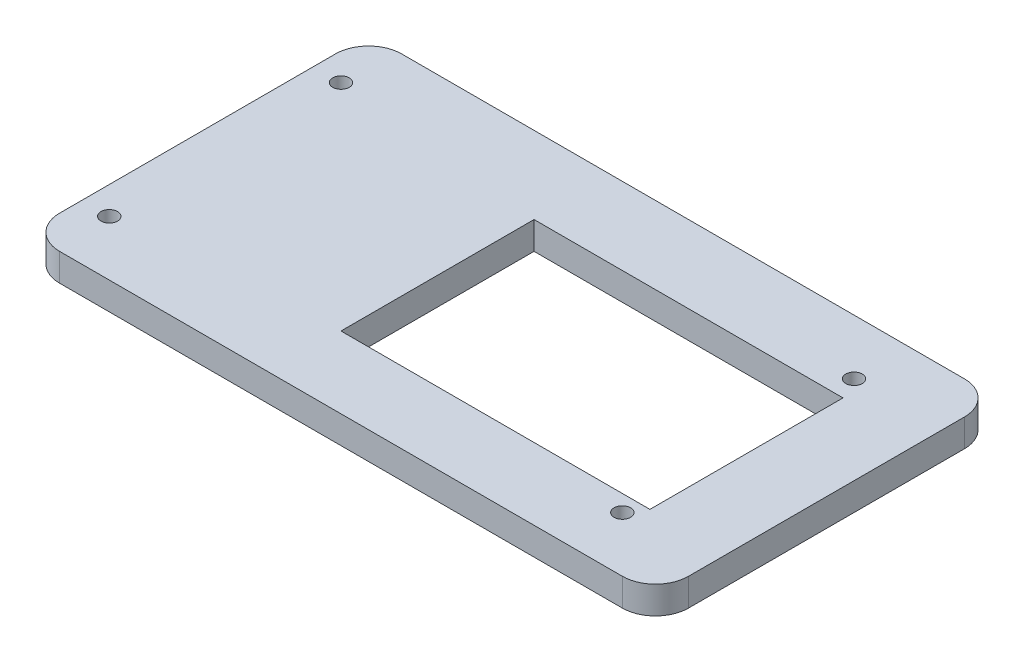
ISO-10303-21;
HEADER;
FILE_DESCRIPTION(('STEP AP214'),'2;1');
FILE_NAME('part.step','',(''),(''),'','','');
FILE_SCHEMA(('AUTOMOTIVE_DESIGN { 1 0 10303 214 1 1 1 1 }'));
ENDSEC;
DATA;
#1=APPLICATION_CONTEXT('core data for automotive mechanical design processes');
#2=APPLICATION_PROTOCOL_DEFINITION('international standard','automotive_design',2000,#1);
#3=PRODUCT_CONTEXT('',#1,'mechanical');
#4=PRODUCT('Part','Part','',(#3));
#5=PRODUCT_RELATED_PRODUCT_CATEGORY('part','',(#4));
#6=PRODUCT_DEFINITION_FORMATION('','',#4);
#7=PRODUCT_DEFINITION_CONTEXT('part definition',#1,'design');
#8=PRODUCT_DEFINITION('design','',#6,#7);
#9=PRODUCT_DEFINITION_SHAPE('','',#8);
#10=(LENGTH_UNIT() NAMED_UNIT(*) SI_UNIT(.MILLI.,.METRE.));
#11=(NAMED_UNIT(*) PLANE_ANGLE_UNIT() SI_UNIT($,.RADIAN.));
#12=(NAMED_UNIT(*) SI_UNIT($,.STERADIAN.) SOLID_ANGLE_UNIT());
#13=UNCERTAINTY_MEASURE_WITH_UNIT(LENGTH_MEASURE(1.E-05),#10,'distance_accuracy_value','');
#14=(GEOMETRIC_REPRESENTATION_CONTEXT(3) GLOBAL_UNCERTAINTY_ASSIGNED_CONTEXT((#13)) GLOBAL_UNIT_ASSIGNED_CONTEXT((#10,
#11,#12)) REPRESENTATION_CONTEXT('',''));
#15=CARTESIAN_POINT('',(0.,0.,0.));
#16=DIRECTION('',(0.,0.,1.));
#17=DIRECTION('',(1.,0.,0.));
#18=AXIS2_PLACEMENT_3D('',#15,#16,#17);
#19=CARTESIAN_POINT('',(0.,5.,0.));
#20=DIRECTION('',(0.,-1.,0.));
#21=DIRECTION('',(0.,0.,-1.));
#22=AXIS2_PLACEMENT_3D('',#19,#20,#21);
#23=PLANE('',#22);
#24=CARTESIAN_POINT('',(15.5,5.,-21.));
#25=DIRECTION('',(0.,-1.,0.));
#26=DIRECTION('',(0.,0.,-1.));
#27=AXIS2_PLACEMENT_3D('',#24,#25,#26);
#28=CIRCLE('',#27,1.5);
#29=CARTESIAN_POINT('',(15.5,5.,-22.5));
#30=VERTEX_POINT('',#29);
#31=EDGE_CURVE('E421',#30,#30,#28,.T.);
#32=ORIENTED_EDGE('',*,*,#31,.T.);
#33=EDGE_LOOP('',(#32));
#34=FACE_BOUND('',#33,.T.);
#35=CARTESIAN_POINT('',(15.5,5.,21.));
#36=DIRECTION('',(0.,-1.,0.));
#37=DIRECTION('',(0.,0.,-1.));
#38=AXIS2_PLACEMENT_3D('',#35,#36,#37);
#39=CIRCLE('',#38,1.5);
#40=CARTESIAN_POINT('',(15.5,5.,19.5));
#41=VERTEX_POINT('',#40);
#42=EDGE_CURVE('E425',#41,#41,#39,.T.);
#43=ORIENTED_EDGE('',*,*,#42,.T.);
#44=EDGE_LOOP('',(#43));
#45=FACE_BOUND('',#44,.T.);
#46=CARTESIAN_POINT('',(-77.5,5.,-21.));
#47=DIRECTION('',(0.,-1.,0.));
#48=DIRECTION('',(0.,0.,-1.));
#49=AXIS2_PLACEMENT_3D('',#46,#47,#48);
#50=CIRCLE('',#49,1.5);
#51=CARTESIAN_POINT('',(-77.5,5.,-22.5));
#52=VERTEX_POINT('',#51);
#53=EDGE_CURVE('E434',#52,#52,#50,.T.);
#54=ORIENTED_EDGE('',*,*,#53,.T.);
#55=EDGE_LOOP('',(#54));
#56=FACE_BOUND('',#55,.T.);
#57=CARTESIAN_POINT('',(-77.5,5.,21.));
#58=DIRECTION('',(0.,-1.,0.));
#59=DIRECTION('',(0.,0.,-1.));
#60=AXIS2_PLACEMENT_3D('',#57,#58,#59);
#61=CIRCLE('',#60,1.5);
#62=CARTESIAN_POINT('',(-77.5,5.,19.5));
#63=VERTEX_POINT('',#62);
#64=EDGE_CURVE('E158',#63,#63,#61,.T.);
#65=ORIENTED_EDGE('',*,*,#64,.T.);
#66=EDGE_LOOP('',(#65));
#67=FACE_BOUND('',#66,.T.);
#68=DIRECTION('',(1.,0.,0.));
#69=VECTOR('',#68,1.);
#70=CARTESIAN_POINT('',(31.5,5.,31.));
#71=LINE('',#70,#69);
#72=CARTESIAN_POINT('',(-76.5,5.,31.));
#73=VERTEX_POINT('',#72);
#74=CARTESIAN_POINT('',(25.5,5.,31.));
#75=VERTEX_POINT('',#74);
#76=EDGE_CURVE('E169',#73,#75,#71,.T.);
#77=ORIENTED_EDGE('',*,*,#76,.T.);
#78=CARTESIAN_POINT('',(25.5,5.,25.));
#79=DIRECTION('',(0.,-1.,0.));
#80=DIRECTION('',(0.,0.,-1.));
#81=AXIS2_PLACEMENT_3D('',#78,#79,#80);
#82=CIRCLE('',#81,6.);
#83=CARTESIAN_POINT('',(31.5,5.,25.));
#84=VERTEX_POINT('',#83);
#85=EDGE_CURVE('E212',#75,#84,#82,.F.);
#86=ORIENTED_EDGE('',*,*,#85,.T.);
#87=DIRECTION('',(0.,0.,-1.));
#88=VECTOR('',#87,1.);
#89=CARTESIAN_POINT('',(31.5,5.,31.));
#90=LINE('',#89,#88);
#91=CARTESIAN_POINT('',(31.5,5.,-25.));
#92=VERTEX_POINT('',#91);
#93=EDGE_CURVE('E172',#84,#92,#90,.T.);
#94=ORIENTED_EDGE('',*,*,#93,.T.);
#95=CARTESIAN_POINT('',(25.5,5.,-25.));
#96=DIRECTION('',(0.,-1.,0.));
#97=DIRECTION('',(0.,0.,-1.));
#98=AXIS2_PLACEMENT_3D('',#95,#96,#97);
#99=CIRCLE('',#98,6.);
#100=CARTESIAN_POINT('',(25.5,5.,-31.));
#101=VERTEX_POINT('',#100);
#102=EDGE_CURVE('E210',#92,#101,#99,.F.);
#103=ORIENTED_EDGE('',*,*,#102,.T.);
#104=DIRECTION('',(-1.,0.,0.));
#105=VECTOR('',#104,1.);
#106=CARTESIAN_POINT('',(-82.5,5.,-31.));
#107=LINE('',#106,#105);
#108=CARTESIAN_POINT('',(-76.5,5.,-31.));
#109=VERTEX_POINT('',#108);
#110=EDGE_CURVE('E176',#101,#109,#107,.T.);
#111=ORIENTED_EDGE('',*,*,#110,.T.);
#112=CARTESIAN_POINT('',(-76.5,5.,-25.));
#113=DIRECTION('',(0.,-1.,0.));
#114=DIRECTION('',(0.,0.,-1.));
#115=AXIS2_PLACEMENT_3D('',#112,#113,#114);
#116=CIRCLE('',#115,6.);
#117=CARTESIAN_POINT('',(-82.5,5.,-25.));
#118=VERTEX_POINT('',#117);
#119=EDGE_CURVE('E56',#109,#118,#116,.F.);
#120=ORIENTED_EDGE('',*,*,#119,.T.);
#121=DIRECTION('',(0.,0.,1.));
#122=VECTOR('',#121,1.);
#123=CARTESIAN_POINT('',(-82.5,5.,-31.));
#124=LINE('',#123,#122);
#125=CARTESIAN_POINT('',(-82.5,5.,25.));
#126=VERTEX_POINT('',#125);
#127=EDGE_CURVE('E178',#118,#126,#124,.T.);
#128=ORIENTED_EDGE('',*,*,#127,.T.);
#129=CARTESIAN_POINT('',(-76.5,5.,25.));
#130=DIRECTION('',(0.,-1.,0.));
#131=DIRECTION('',(0.,0.,-1.));
#132=AXIS2_PLACEMENT_3D('',#129,#130,#131);
#133=CIRCLE('',#132,6.);
#134=EDGE_CURVE('E207',#126,#73,#133,.F.);
#135=ORIENTED_EDGE('',*,*,#134,.T.);
#136=EDGE_LOOP('',(#77,#86,#94,#103,#111,#120,#128,#135));
#137=FACE_BOUND('',#136,.T.);
#138=DIRECTION('',(0.,0.,1.));
#139=VECTOR('',#138,1.);
#140=CARTESIAN_POINT('',(-38.5,5.,18.));
#141=LINE('',#140,#139);
#142=CARTESIAN_POINT('',(-38.5,5.,-17.));
#143=VERTEX_POINT('',#142);
#144=CARTESIAN_POINT('',(-38.5,5.,18.));
#145=VERTEX_POINT('',#144);
#146=EDGE_CURVE('E126',#143,#145,#141,.T.);
#147=ORIENTED_EDGE('',*,*,#146,.F.);
#148=DIRECTION('',(-1.,0.,0.));
#149=VECTOR('',#148,1.);
#150=CARTESIAN_POINT('',(-38.5,5.,-17.));
#151=LINE('',#150,#149);
#152=CARTESIAN_POINT('',(17.5,5.,-17.));
#153=VERTEX_POINT('',#152);
#154=EDGE_CURVE('E151',#153,#143,#151,.T.);
#155=ORIENTED_EDGE('',*,*,#154,.F.);
#156=DIRECTION('',(0.,0.,-1.));
#157=VECTOR('',#156,1.);
#158=CARTESIAN_POINT('',(17.5,5.,18.));
#159=LINE('',#158,#157);
#160=CARTESIAN_POINT('',(17.5,5.,18.));
#161=VERTEX_POINT('',#160);
#162=EDGE_CURVE('E149',#161,#153,#159,.T.);
#163=ORIENTED_EDGE('',*,*,#162,.F.);
#164=DIRECTION('',(1.,0.,0.));
#165=VECTOR('',#164,1.);
#166=CARTESIAN_POINT('',(-38.5,5.,18.));
#167=LINE('',#166,#165);
#168=EDGE_CURVE('E136',#145,#161,#167,.T.);
#169=ORIENTED_EDGE('',*,*,#168,.F.);
#170=EDGE_LOOP('',(#147,#155,#163,#169));
#171=FACE_BOUND('',#170,.T.);
#172=ADVANCED_FACE('F35',(#34,#45,#56,#67,#137,#171),#23,.F.);
#173=CARTESIAN_POINT('',(0.,0.,0.));
#174=DIRECTION('',(0.,-1.,0.));
#175=DIRECTION('',(0.,0.,-1.));
#176=AXIS2_PLACEMENT_3D('',#173,#174,#175);
#177=PLANE('',#176);
#178=CARTESIAN_POINT('',(15.5,0.,-21.));
#179=DIRECTION('',(0.,-1.,0.));
#180=DIRECTION('',(0.,0.,-1.));
#181=AXIS2_PLACEMENT_3D('',#178,#179,#180);
#182=CIRCLE('',#181,1.5);
#183=CARTESIAN_POINT('',(15.5,0.,-22.5));
#184=VERTEX_POINT('',#183);
#185=EDGE_CURVE('E419',#184,#184,#182,.T.);
#186=ORIENTED_EDGE('',*,*,#185,.F.);
#187=EDGE_LOOP('',(#186));
#188=FACE_BOUND('',#187,.T.);
#189=CARTESIAN_POINT('',(15.5,0.,21.));
#190=DIRECTION('',(0.,-1.,0.));
#191=DIRECTION('',(0.,0.,-1.));
#192=AXIS2_PLACEMENT_3D('',#189,#190,#191);
#193=CIRCLE('',#192,1.5);
#194=CARTESIAN_POINT('',(15.5,0.,19.5));
#195=VERTEX_POINT('',#194);
#196=EDGE_CURVE('E422',#195,#195,#193,.T.);
#197=ORIENTED_EDGE('',*,*,#196,.F.);
#198=EDGE_LOOP('',(#197));
#199=FACE_BOUND('',#198,.T.);
#200=CARTESIAN_POINT('',(-77.5,0.,-21.));
#201=DIRECTION('',(0.,-1.,0.));
#202=DIRECTION('',(0.,0.,-1.));
#203=AXIS2_PLACEMENT_3D('',#200,#201,#202);
#204=CIRCLE('',#203,1.5);
#205=CARTESIAN_POINT('',(-77.5,0.,-22.5));
#206=VERTEX_POINT('',#205);
#207=EDGE_CURVE('E431',#206,#206,#204,.T.);
#208=ORIENTED_EDGE('',*,*,#207,.F.);
#209=EDGE_LOOP('',(#208));
#210=FACE_BOUND('',#209,.T.);
#211=CARTESIAN_POINT('',(-77.5,0.,21.));
#212=DIRECTION('',(0.,-1.,0.));
#213=DIRECTION('',(0.,0.,-1.));
#214=AXIS2_PLACEMENT_3D('',#211,#212,#213);
#215=CIRCLE('',#214,1.5);
#216=CARTESIAN_POINT('',(-77.5,0.,19.5));
#217=VERTEX_POINT('',#216);
#218=EDGE_CURVE('E437',#217,#217,#215,.T.);
#219=ORIENTED_EDGE('',*,*,#218,.F.);
#220=EDGE_LOOP('',(#219));
#221=FACE_BOUND('',#220,.T.);
#222=DIRECTION('',(0.,0.,-1.));
#223=VECTOR('',#222,1.);
#224=CARTESIAN_POINT('',(31.5,0.,31.));
#225=LINE('',#224,#223);
#226=CARTESIAN_POINT('',(31.5,0.,25.));
#227=VERTEX_POINT('',#226);
#228=CARTESIAN_POINT('',(31.5,0.,-25.));
#229=VERTEX_POINT('',#228);
#230=EDGE_CURVE('E144',#227,#229,#225,.T.);
#231=ORIENTED_EDGE('',*,*,#230,.F.);
#232=CARTESIAN_POINT('',(25.5,0.,25.));
#233=DIRECTION('',(0.,-1.,0.));
#234=DIRECTION('',(0.,0.,-1.));
#235=AXIS2_PLACEMENT_3D('',#232,#233,#234);
#236=CIRCLE('',#235,6.);
#237=CARTESIAN_POINT('',(25.5,0.,31.));
#238=VERTEX_POINT('',#237);
#239=EDGE_CURVE('E200',#227,#238,#236,.T.);
#240=ORIENTED_EDGE('',*,*,#239,.T.);
#241=DIRECTION('',(1.,0.,0.));
#242=VECTOR('',#241,1.);
#243=CARTESIAN_POINT('',(-31.5,0.,31.));
#244=LINE('',#243,#242);
#245=CARTESIAN_POINT('',(-76.5,0.,31.));
#246=VERTEX_POINT('',#245);
#247=EDGE_CURVE('E173',#246,#238,#244,.T.);
#248=ORIENTED_EDGE('',*,*,#247,.F.);
#249=CARTESIAN_POINT('',(-76.5,0.,25.));
#250=DIRECTION('',(0.,-1.,0.));
#251=DIRECTION('',(0.,0.,-1.));
#252=AXIS2_PLACEMENT_3D('',#249,#250,#251);
#253=CIRCLE('',#252,6.);
#254=CARTESIAN_POINT('',(-82.5,0.,25.));
#255=VERTEX_POINT('',#254);
#256=EDGE_CURVE('E194',#246,#255,#253,.T.);
#257=ORIENTED_EDGE('',*,*,#256,.T.);
#258=DIRECTION('',(0.,0.,1.));
#259=VECTOR('',#258,1.);
#260=CARTESIAN_POINT('',(-82.5,0.,31.));
#261=LINE('',#260,#259);
#262=CARTESIAN_POINT('',(-82.5,0.,-25.));
#263=VERTEX_POINT('',#262);
#264=EDGE_CURVE('E186',#263,#255,#261,.T.);
#265=ORIENTED_EDGE('',*,*,#264,.F.);
#266=CARTESIAN_POINT('',(-76.5,0.,-25.));
#267=DIRECTION('',(0.,-1.,0.));
#268=DIRECTION('',(0.,0.,-1.));
#269=AXIS2_PLACEMENT_3D('',#266,#267,#268);
#270=CIRCLE('',#269,6.);
#271=CARTESIAN_POINT('',(-76.5,0.,-31.));
#272=VERTEX_POINT('',#271);
#273=EDGE_CURVE('E196',#263,#272,#270,.T.);
#274=ORIENTED_EDGE('',*,*,#273,.T.);
#275=DIRECTION('',(-1.,0.,0.));
#276=VECTOR('',#275,1.);
#277=CARTESIAN_POINT('',(-82.5,0.,-31.));
#278=LINE('',#277,#276);
#279=CARTESIAN_POINT('',(25.5,0.,-31.));
#280=VERTEX_POINT('',#279);
#281=EDGE_CURVE('E183',#280,#272,#278,.T.);
#282=ORIENTED_EDGE('',*,*,#281,.F.);
#283=CARTESIAN_POINT('',(25.5,0.,-25.));
#284=DIRECTION('',(0.,-1.,0.));
#285=DIRECTION('',(0.,0.,-1.));
#286=AXIS2_PLACEMENT_3D('',#283,#284,#285);
#287=CIRCLE('',#286,6.);
#288=EDGE_CURVE('E198',#280,#229,#287,.T.);
#289=ORIENTED_EDGE('',*,*,#288,.T.);
#290=EDGE_LOOP('',(#231,#240,#248,#257,#265,#274,#282,#289));
#291=FACE_BOUND('',#290,.T.);
#292=DIRECTION('',(-1.,0.,0.));
#293=VECTOR('',#292,1.);
#294=CARTESIAN_POINT('',(-38.5,0.,-17.));
#295=LINE('',#294,#293);
#296=CARTESIAN_POINT('',(17.5,0.,-17.));
#297=VERTEX_POINT('',#296);
#298=CARTESIAN_POINT('',(-38.5,0.,-17.));
#299=VERTEX_POINT('',#298);
#300=EDGE_CURVE('E137',#297,#299,#295,.T.);
#301=ORIENTED_EDGE('',*,*,#300,.T.);
#302=DIRECTION('',(0.,0.,1.));
#303=VECTOR('',#302,1.);
#304=CARTESIAN_POINT('',(-38.5,0.,18.));
#305=LINE('',#304,#303);
#306=CARTESIAN_POINT('',(-38.5,0.,18.));
#307=VERTEX_POINT('',#306);
#308=EDGE_CURVE('E156',#299,#307,#305,.T.);
#309=ORIENTED_EDGE('',*,*,#308,.T.);
#310=DIRECTION('',(1.,0.,0.));
#311=VECTOR('',#310,1.);
#312=CARTESIAN_POINT('',(-38.5,0.,18.));
#313=LINE('',#312,#311);
#314=CARTESIAN_POINT('',(17.5,0.,18.));
#315=VERTEX_POINT('',#314);
#316=EDGE_CURVE('E143',#307,#315,#313,.T.);
#317=ORIENTED_EDGE('',*,*,#316,.T.);
#318=DIRECTION('',(0.,0.,-1.));
#319=VECTOR('',#318,1.);
#320=CARTESIAN_POINT('',(17.5,0.,18.));
#321=LINE('',#320,#319);
#322=EDGE_CURVE('E160',#315,#297,#321,.T.);
#323=ORIENTED_EDGE('',*,*,#322,.T.);
#324=EDGE_LOOP('',(#301,#309,#317,#323));
#325=FACE_BOUND('',#324,.T.);
#326=ADVANCED_FACE('F228',(#188,#199,#210,#221,#291,#325),#177,.T.);
#327=CARTESIAN_POINT('',(31.5,5.,31.));
#328=DIRECTION('',(-1.,0.,0.));
#329=DIRECTION('',(0.,0.,1.));
#330=AXIS2_PLACEMENT_3D('',#327,#328,#329);
#331=PLANE('',#330);
#332=ORIENTED_EDGE('',*,*,#93,.F.);
#333=DIRECTION('',(0.,-1.,0.));
#334=VECTOR('',#333,1.);
#335=CARTESIAN_POINT('',(31.5,5.,25.));
#336=LINE('',#335,#334);
#337=EDGE_CURVE('E191',#84,#227,#336,.T.);
#338=ORIENTED_EDGE('',*,*,#337,.T.);
#339=ORIENTED_EDGE('',*,*,#230,.T.);
#340=DIRECTION('',(0.,-1.,0.));
#341=VECTOR('',#340,1.);
#342=CARTESIAN_POINT('',(31.5,5.,-25.));
#343=LINE('',#342,#341);
#344=EDGE_CURVE('E180',#229,#92,#343,.F.);
#345=ORIENTED_EDGE('',*,*,#344,.T.);
#346=EDGE_LOOP('',(#332,#338,#339,#345));
#347=FACE_BOUND('',#346,.T.);
#348=ADVANCED_FACE('F249',(#347),#331,.F.);
#349=CARTESIAN_POINT('',(-82.5,5.,-31.));
#350=DIRECTION('',(0.,0.,1.));
#351=DIRECTION('',(1.,0.,0.));
#352=AXIS2_PLACEMENT_3D('',#349,#350,#351);
#353=PLANE('',#352);
#354=ORIENTED_EDGE('',*,*,#110,.F.);
#355=DIRECTION('',(0.,-1.,0.));
#356=VECTOR('',#355,1.);
#357=CARTESIAN_POINT('',(25.5,5.,-31.));
#358=LINE('',#357,#356);
#359=EDGE_CURVE('E216',#101,#280,#358,.T.);
#360=ORIENTED_EDGE('',*,*,#359,.T.);
#361=ORIENTED_EDGE('',*,*,#281,.T.);
#362=DIRECTION('',(0.,-1.,0.));
#363=VECTOR('',#362,1.);
#364=CARTESIAN_POINT('',(-76.5,5.,-31.));
#365=LINE('',#364,#363);
#366=EDGE_CURVE('E214',#272,#109,#365,.F.);
#367=ORIENTED_EDGE('',*,*,#366,.T.);
#368=EDGE_LOOP('',(#354,#360,#361,#367));
#369=FACE_BOUND('',#368,.T.);
#370=ADVANCED_FACE('F222',(#369),#353,.F.);
#371=CARTESIAN_POINT('',(-82.5,5.,31.));
#372=DIRECTION('',(1.,0.,0.));
#373=DIRECTION('',(0.,0.,-1.));
#374=AXIS2_PLACEMENT_3D('',#371,#372,#373);
#375=PLANE('',#374);
#376=ORIENTED_EDGE('',*,*,#127,.F.);
#377=DIRECTION('',(0.,-1.,0.));
#378=VECTOR('',#377,1.);
#379=CARTESIAN_POINT('',(-82.5,5.,-25.));
#380=LINE('',#379,#378);
#381=EDGE_CURVE('E11',#118,#263,#380,.T.);
#382=ORIENTED_EDGE('',*,*,#381,.T.);
#383=ORIENTED_EDGE('',*,*,#264,.T.);
#384=DIRECTION('',(0.,-1.,0.));
#385=VECTOR('',#384,1.);
#386=CARTESIAN_POINT('',(-82.5,5.,25.));
#387=LINE('',#386,#385);
#388=EDGE_CURVE('E43',#255,#126,#387,.F.);
#389=ORIENTED_EDGE('',*,*,#388,.T.);
#390=EDGE_LOOP('',(#376,#382,#383,#389));
#391=FACE_BOUND('',#390,.T.);
#392=ADVANCED_FACE('F234',(#391),#375,.F.);
#393=CARTESIAN_POINT('',(-31.5,5.,31.));
#394=DIRECTION('',(0.,0.,-1.));
#395=DIRECTION('',(-1.,0.,0.));
#396=AXIS2_PLACEMENT_3D('',#393,#394,#395);
#397=PLANE('',#396);
#398=ORIENTED_EDGE('',*,*,#247,.T.);
#399=DIRECTION('',(0.,-1.,0.));
#400=VECTOR('',#399,1.);
#401=CARTESIAN_POINT('',(25.5,5.,31.));
#402=LINE('',#401,#400);
#403=EDGE_CURVE('E205',#238,#75,#402,.F.);
#404=ORIENTED_EDGE('',*,*,#403,.T.);
#405=ORIENTED_EDGE('',*,*,#76,.F.);
#406=DIRECTION('',(0.,-1.,0.));
#407=VECTOR('',#406,1.);
#408=CARTESIAN_POINT('',(-76.5,5.,31.));
#409=LINE('',#408,#407);
#410=EDGE_CURVE('E202',#73,#246,#409,.T.);
#411=ORIENTED_EDGE('',*,*,#410,.T.);
#412=EDGE_LOOP('',(#398,#404,#405,#411));
#413=FACE_BOUND('',#412,.T.);
#414=ADVANCED_FACE('F241',(#413),#397,.F.);
#415=CARTESIAN_POINT('',(-38.5,5.,18.));
#416=DIRECTION('',(1.,0.,0.));
#417=DIRECTION('',(0.,0.,-1.));
#418=AXIS2_PLACEMENT_3D('',#415,#416,#417);
#419=PLANE('',#418);
#420=ORIENTED_EDGE('',*,*,#308,.F.);
#421=DIRECTION('',(0.,-1.,0.));
#422=VECTOR('',#421,1.);
#423=CARTESIAN_POINT('',(-38.5,5.,-17.));
#424=LINE('',#423,#422);
#425=EDGE_CURVE('E132',#143,#299,#424,.T.);
#426=ORIENTED_EDGE('',*,*,#425,.F.);
#427=ORIENTED_EDGE('',*,*,#146,.T.);
#428=DIRECTION('',(0.,-1.,0.));
#429=VECTOR('',#428,1.);
#430=CARTESIAN_POINT('',(-38.5,5.,18.));
#431=LINE('',#430,#429);
#432=EDGE_CURVE('E129',#145,#307,#431,.T.);
#433=ORIENTED_EDGE('',*,*,#432,.T.);
#434=EDGE_LOOP('',(#420,#426,#427,#433));
#435=FACE_BOUND('',#434,.T.);
#436=ADVANCED_FACE('F128',(#435),#419,.T.);
#437=CARTESIAN_POINT('',(-38.5,5.,18.));
#438=DIRECTION('',(0.,0.,-1.));
#439=DIRECTION('',(-1.,0.,0.));
#440=AXIS2_PLACEMENT_3D('',#437,#438,#439);
#441=PLANE('',#440);
#442=ORIENTED_EDGE('',*,*,#316,.F.);
#443=ORIENTED_EDGE('',*,*,#432,.F.);
#444=ORIENTED_EDGE('',*,*,#168,.T.);
#445=DIRECTION('',(0.,-1.,0.));
#446=VECTOR('',#445,1.);
#447=CARTESIAN_POINT('',(17.5,5.,18.));
#448=LINE('',#447,#446);
#449=EDGE_CURVE('E145',#161,#315,#448,.T.);
#450=ORIENTED_EDGE('',*,*,#449,.T.);
#451=EDGE_LOOP('',(#442,#443,#444,#450));
#452=FACE_BOUND('',#451,.T.);
#453=ADVANCED_FACE('F140',(#452),#441,.T.);
#454=CARTESIAN_POINT('',(17.5,5.,18.));
#455=DIRECTION('',(-1.,0.,0.));
#456=DIRECTION('',(0.,0.,1.));
#457=AXIS2_PLACEMENT_3D('',#454,#455,#456);
#458=PLANE('',#457);
#459=ORIENTED_EDGE('',*,*,#322,.F.);
#460=ORIENTED_EDGE('',*,*,#449,.F.);
#461=ORIENTED_EDGE('',*,*,#162,.T.);
#462=DIRECTION('',(0.,-1.,0.));
#463=VECTOR('',#462,1.);
#464=CARTESIAN_POINT('',(17.5,5.,-17.));
#465=LINE('',#464,#463);
#466=EDGE_CURVE('E166',#153,#297,#465,.T.);
#467=ORIENTED_EDGE('',*,*,#466,.T.);
#468=EDGE_LOOP('',(#459,#460,#461,#467));
#469=FACE_BOUND('',#468,.T.);
#470=ADVANCED_FACE('F308',(#469),#458,.T.);
#471=CARTESIAN_POINT('',(-38.5,5.,-17.));
#472=DIRECTION('',(0.,0.,1.));
#473=DIRECTION('',(1.,0.,0.));
#474=AXIS2_PLACEMENT_3D('',#471,#472,#473);
#475=PLANE('',#474);
#476=ORIENTED_EDGE('',*,*,#300,.F.);
#477=ORIENTED_EDGE('',*,*,#466,.F.);
#478=ORIENTED_EDGE('',*,*,#154,.T.);
#479=ORIENTED_EDGE('',*,*,#425,.T.);
#480=EDGE_LOOP('',(#476,#477,#478,#479));
#481=FACE_BOUND('',#480,.T.);
#482=ADVANCED_FACE('F314',(#481),#475,.T.);
#483=CARTESIAN_POINT('',(-77.5,10.,21.));
#484=DIRECTION('',(0.,-1.,0.));
#485=DIRECTION('',(0.,0.,-1.));
#486=AXIS2_PLACEMENT_3D('',#483,#484,#485);
#487=CYLINDRICAL_SURFACE('',#486,1.5);
#488=ORIENTED_EDGE('',*,*,#218,.T.);
#489=EDGE_LOOP('',(#488));
#490=FACE_BOUND('',#489,.T.);
#491=ORIENTED_EDGE('',*,*,#64,.F.);
#492=EDGE_LOOP('',(#491));
#493=FACE_BOUND('',#492,.T.);
#494=ADVANCED_FACE('F322',(#490,#493),#487,.F.);
#495=CARTESIAN_POINT('',(-77.5,10.,-21.));
#496=DIRECTION('',(0.,-1.,0.));
#497=DIRECTION('',(0.,0.,-1.));
#498=AXIS2_PLACEMENT_3D('',#495,#496,#497);
#499=CYLINDRICAL_SURFACE('',#498,1.5);
#500=ORIENTED_EDGE('',*,*,#207,.T.);
#501=EDGE_LOOP('',(#500));
#502=FACE_BOUND('',#501,.T.);
#503=ORIENTED_EDGE('',*,*,#53,.F.);
#504=EDGE_LOOP('',(#503));
#505=FACE_BOUND('',#504,.T.);
#506=ADVANCED_FACE('F330',(#502,#505),#499,.F.);
#507=CARTESIAN_POINT('',(15.5,10.,21.));
#508=DIRECTION('',(0.,-1.,0.));
#509=DIRECTION('',(0.,0.,-1.));
#510=AXIS2_PLACEMENT_3D('',#507,#508,#509);
#511=CYLINDRICAL_SURFACE('',#510,1.5);
#512=ORIENTED_EDGE('',*,*,#196,.T.);
#513=EDGE_LOOP('',(#512));
#514=FACE_BOUND('',#513,.T.);
#515=ORIENTED_EDGE('',*,*,#42,.F.);
#516=EDGE_LOOP('',(#515));
#517=FACE_BOUND('',#516,.T.);
#518=ADVANCED_FACE('F338',(#514,#517),#511,.F.);
#519=CARTESIAN_POINT('',(15.5,10.,-21.));
#520=DIRECTION('',(0.,-1.,0.));
#521=DIRECTION('',(0.,0.,-1.));
#522=AXIS2_PLACEMENT_3D('',#519,#520,#521);
#523=CYLINDRICAL_SURFACE('',#522,1.5);
#524=ORIENTED_EDGE('',*,*,#185,.T.);
#525=EDGE_LOOP('',(#524));
#526=FACE_BOUND('',#525,.T.);
#527=ORIENTED_EDGE('',*,*,#31,.F.);
#528=EDGE_LOOP('',(#527));
#529=FACE_BOUND('',#528,.T.);
#530=ADVANCED_FACE('F258',(#526,#529),#523,.F.);
#531=CARTESIAN_POINT('',(25.5,5.,25.));
#532=DIRECTION('',(0.,-1.,0.));
#533=DIRECTION('',(0.,0.,-1.));
#534=AXIS2_PLACEMENT_3D('',#531,#532,#533);
#535=CYLINDRICAL_SURFACE('',#534,6.);
#536=ORIENTED_EDGE('',*,*,#85,.F.);
#537=ORIENTED_EDGE('',*,*,#403,.F.);
#538=ORIENTED_EDGE('',*,*,#239,.F.);
#539=ORIENTED_EDGE('',*,*,#337,.F.);
#540=EDGE_LOOP('',(#536,#537,#538,#539));
#541=FACE_BOUND('',#540,.T.);
#542=ADVANCED_FACE('F246',(#541),#535,.T.);
#543=CARTESIAN_POINT('',(25.5,5.,-25.));
#544=DIRECTION('',(0.,-1.,0.));
#545=DIRECTION('',(0.,0.,-1.));
#546=AXIS2_PLACEMENT_3D('',#543,#544,#545);
#547=CYLINDRICAL_SURFACE('',#546,6.);
#548=ORIENTED_EDGE('',*,*,#102,.F.);
#549=ORIENTED_EDGE('',*,*,#344,.F.);
#550=ORIENTED_EDGE('',*,*,#288,.F.);
#551=ORIENTED_EDGE('',*,*,#359,.F.);
#552=EDGE_LOOP('',(#548,#549,#550,#551));
#553=FACE_BOUND('',#552,.T.);
#554=ADVANCED_FACE('F251',(#553),#547,.T.);
#555=CARTESIAN_POINT('',(-76.5,5.,-25.));
#556=DIRECTION('',(0.,-1.,0.));
#557=DIRECTION('',(0.,0.,-1.));
#558=AXIS2_PLACEMENT_3D('',#555,#556,#557);
#559=CYLINDRICAL_SURFACE('',#558,6.);
#560=ORIENTED_EDGE('',*,*,#119,.F.);
#561=ORIENTED_EDGE('',*,*,#366,.F.);
#562=ORIENTED_EDGE('',*,*,#273,.F.);
#563=ORIENTED_EDGE('',*,*,#381,.F.);
#564=EDGE_LOOP('',(#560,#561,#562,#563));
#565=FACE_BOUND('',#564,.T.);
#566=ADVANCED_FACE('F233',(#565),#559,.T.);
#567=CARTESIAN_POINT('',(-76.5,5.,25.));
#568=DIRECTION('',(0.,-1.,0.));
#569=DIRECTION('',(0.,0.,-1.));
#570=AXIS2_PLACEMENT_3D('',#567,#568,#569);
#571=CYLINDRICAL_SURFACE('',#570,6.);
#572=ORIENTED_EDGE('',*,*,#134,.F.);
#573=ORIENTED_EDGE('',*,*,#388,.F.);
#574=ORIENTED_EDGE('',*,*,#256,.F.);
#575=ORIENTED_EDGE('',*,*,#410,.F.);
#576=EDGE_LOOP('',(#572,#573,#574,#575));
#577=FACE_BOUND('',#576,.T.);
#578=ADVANCED_FACE('F37',(#577),#571,.T.);
#579=CLOSED_SHELL('',(#172,#326,#348,#370,#392,#414,#436,#453,#470,#482,#494,#506,#518,#530,
#542,#554,#566,#578));
#580=MANIFOLD_SOLID_BREP('B2',#579);
#581=ADVANCED_BREP_SHAPE_REPRESENTATION('',(#18,#580),#14);
#582=SHAPE_DEFINITION_REPRESENTATION(#9,#581);
ENDSEC;
END-ISO-10303-21;
